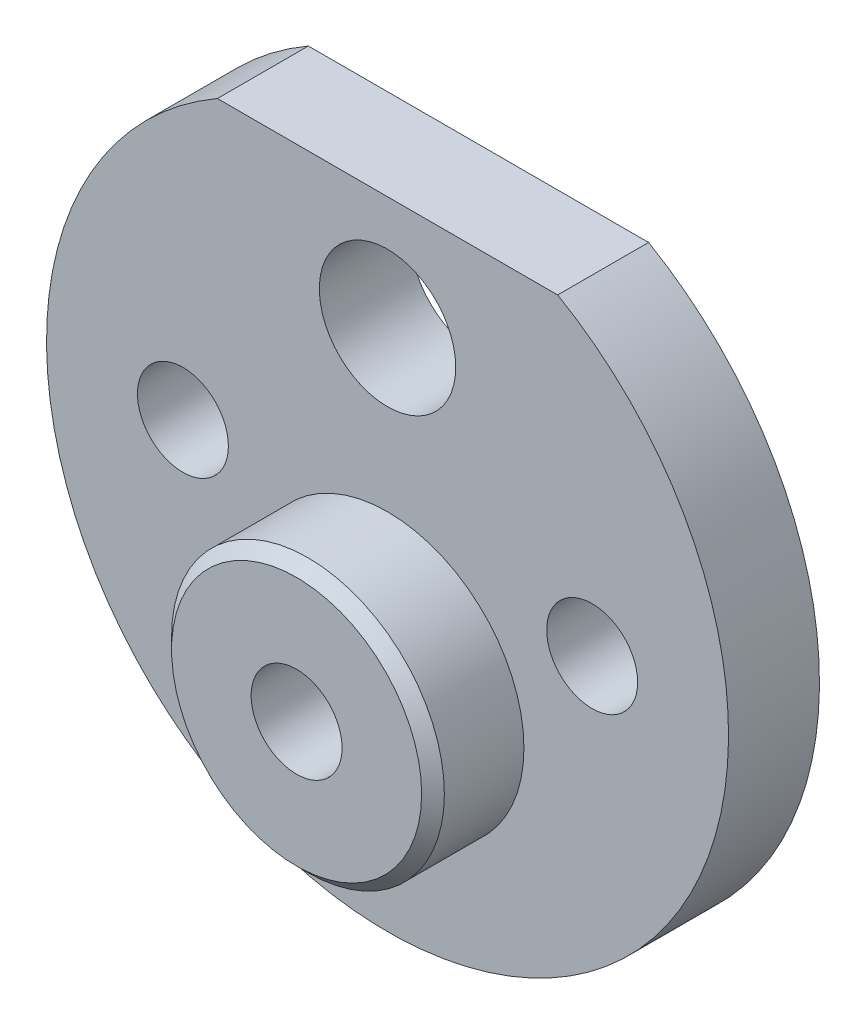
ISO-10303-21;
HEADER;
FILE_DESCRIPTION(('STEP AP214'),'2;1');
FILE_NAME('part.step','',(''),(''),'','','');
FILE_SCHEMA(('AUTOMOTIVE_DESIGN { 1 0 10303 214 1 1 1 1 }'));
ENDSEC;
DATA;
#1=APPLICATION_CONTEXT('core data for automotive mechanical design processes');
#2=APPLICATION_PROTOCOL_DEFINITION('international standard','automotive_design',2000,#1);
#3=PRODUCT_CONTEXT('',#1,'mechanical');
#4=PRODUCT('Part','Part','',(#3));
#5=PRODUCT_RELATED_PRODUCT_CATEGORY('part','',(#4));
#6=PRODUCT_DEFINITION_FORMATION('','',#4);
#7=PRODUCT_DEFINITION_CONTEXT('part definition',#1,'design');
#8=PRODUCT_DEFINITION('design','',#6,#7);
#9=PRODUCT_DEFINITION_SHAPE('','',#8);
#10=(LENGTH_UNIT() NAMED_UNIT(*) SI_UNIT(.MILLI.,.METRE.));
#11=(NAMED_UNIT(*) PLANE_ANGLE_UNIT() SI_UNIT($,.RADIAN.));
#12=(NAMED_UNIT(*) SI_UNIT($,.STERADIAN.) SOLID_ANGLE_UNIT());
#13=UNCERTAINTY_MEASURE_WITH_UNIT(LENGTH_MEASURE(1.E-05),#10,'distance_accuracy_value','');
#14=(GEOMETRIC_REPRESENTATION_CONTEXT(3) GLOBAL_UNCERTAINTY_ASSIGNED_CONTEXT((#13)) GLOBAL_UNIT_ASSIGNED_CONTEXT((#10,
#11,#12)) REPRESENTATION_CONTEXT('',''));
#15=CARTESIAN_POINT('',(0.,0.,0.));
#16=DIRECTION('',(0.,0.,1.));
#17=DIRECTION('',(1.,0.,0.));
#18=AXIS2_PLACEMENT_3D('',#15,#16,#17);
#19=CARTESIAN_POINT('',(0.,0.,4.));
#20=DIRECTION('',(0.,0.,1.));
#21=DIRECTION('',(1.,0.,0.));
#22=AXIS2_PLACEMENT_3D('',#19,#20,#21);
#23=PLANE('',#22);
#24=CARTESIAN_POINT('',(0.,-5.,4.));
#25=DIRECTION('',(0.,0.,1.));
#26=DIRECTION('',(1.,0.,0.));
#27=AXIS2_PLACEMENT_3D('',#24,#25,#26);
#28=CIRCLE('',#27,6.);
#29=CARTESIAN_POINT('',(6.,-5.,4.));
#30=VERTEX_POINT('',#29);
#31=EDGE_CURVE('E192',#30,#30,#28,.T.);
#32=ORIENTED_EDGE('',*,*,#31,.F.);
#33=EDGE_LOOP('',(#32));
#34=FACE_BOUND('',#33,.T.);
#35=CARTESIAN_POINT('',(0.,8.,4.));
#36=DIRECTION('',(0.,0.,1.));
#37=DIRECTION('',(1.,0.,0.));
#38=AXIS2_PLACEMENT_3D('',#35,#36,#37);
#39=CIRCLE('',#38,3.);
#40=CARTESIAN_POINT('',(3.,8.,4.));
#41=VERTEX_POINT('',#40);
#42=EDGE_CURVE('E207',#41,#41,#39,.T.);
#43=ORIENTED_EDGE('',*,*,#42,.F.);
#44=EDGE_LOOP('',(#43));
#45=FACE_BOUND('',#44,.T.);
#46=CARTESIAN_POINT('',(0.,0.,4.));
#47=DIRECTION('',(0.,0.,1.));
#48=DIRECTION('',(1.,0.,0.));
#49=AXIS2_PLACEMENT_3D('',#46,#47,#48);
#50=CIRCLE('',#49,15.);
#51=CARTESIAN_POINT('',(-7.48331477354788,13.,4.));
#52=VERTEX_POINT('',#51);
#53=CARTESIAN_POINT('',(7.48331477354788,13.,4.));
#54=VERTEX_POINT('',#53);
#55=EDGE_CURVE('E66',#52,#54,#50,.T.);
#56=ORIENTED_EDGE('',*,*,#55,.T.);
#57=DIRECTION('',(-1.,0.,0.));
#58=VECTOR('',#57,1.);
#59=CARTESIAN_POINT('',(-7.48331477354788,13.,4.));
#60=LINE('',#59,#58);
#61=EDGE_CURVE('E48',#54,#52,#60,.T.);
#62=ORIENTED_EDGE('',*,*,#61,.T.);
#63=EDGE_LOOP('',(#56,#62));
#64=FACE_BOUND('',#63,.T.);
#65=CARTESIAN_POINT('',(-9.,0.,4.));
#66=DIRECTION('',(0.,0.,1.));
#67=DIRECTION('',(1.,0.,0.));
#68=AXIS2_PLACEMENT_3D('',#65,#66,#67);
#69=CIRCLE('',#68,2.);
#70=CARTESIAN_POINT('',(-7.,0.,4.));
#71=VERTEX_POINT('',#70);
#72=EDGE_CURVE('E74',#71,#71,#69,.T.);
#73=ORIENTED_EDGE('',*,*,#72,.F.);
#74=EDGE_LOOP('',(#73));
#75=FACE_BOUND('',#74,.T.);
#76=CARTESIAN_POINT('',(9.,0.,4.));
#77=DIRECTION('',(0.,0.,1.));
#78=DIRECTION('',(1.,0.,0.));
#79=AXIS2_PLACEMENT_3D('',#76,#77,#78);
#80=CIRCLE('',#79,2.);
#81=CARTESIAN_POINT('',(11.,0.,4.));
#82=VERTEX_POINT('',#81);
#83=EDGE_CURVE('E197',#82,#82,#80,.T.);
#84=ORIENTED_EDGE('',*,*,#83,.F.);
#85=EDGE_LOOP('',(#84));
#86=FACE_BOUND('',#85,.T.);
#87=ADVANCED_FACE('F32',(#34,#45,#64,#75,#86),#23,.T.);
#88=CARTESIAN_POINT('',(0.,0.,0.));
#89=DIRECTION('',(0.,0.,1.));
#90=DIRECTION('',(1.,0.,0.));
#91=AXIS2_PLACEMENT_3D('',#88,#89,#90);
#92=PLANE('',#91);
#93=CARTESIAN_POINT('',(0.,-5.,0.));
#94=DIRECTION('',(0.,0.,1.));
#95=DIRECTION('',(1.,0.,0.));
#96=AXIS2_PLACEMENT_3D('',#93,#94,#95);
#97=CIRCLE('',#96,2.);
#98=CARTESIAN_POINT('',(2.,-5.,0.));
#99=VERTEX_POINT('',#98);
#100=EDGE_CURVE('E194',#99,#99,#97,.T.);
#101=ORIENTED_EDGE('',*,*,#100,.T.);
#102=EDGE_LOOP('',(#101));
#103=FACE_BOUND('',#102,.T.);
#104=CARTESIAN_POINT('',(0.,0.,0.));
#105=DIRECTION('',(0.,0.,1.));
#106=DIRECTION('',(1.,0.,0.));
#107=AXIS2_PLACEMENT_3D('',#104,#105,#106);
#108=CIRCLE('',#107,15.);
#109=CARTESIAN_POINT('',(-7.48331477354788,13.,0.));
#110=VERTEX_POINT('',#109);
#111=CARTESIAN_POINT('',(7.48331477354788,13.,0.));
#112=VERTEX_POINT('',#111);
#113=EDGE_CURVE('E67',#110,#112,#108,.T.);
#114=ORIENTED_EDGE('',*,*,#113,.F.);
#115=DIRECTION('',(-1.,0.,0.));
#116=VECTOR('',#115,1.);
#117=CARTESIAN_POINT('',(-7.48331477354788,13.,0.));
#118=LINE('',#117,#116);
#119=EDGE_CURVE('E56',#112,#110,#118,.T.);
#120=ORIENTED_EDGE('',*,*,#119,.F.);
#121=EDGE_LOOP('',(#114,#120));
#122=FACE_BOUND('',#121,.T.);
#123=CARTESIAN_POINT('',(-9.,0.,0.));
#124=DIRECTION('',(0.,0.,1.));
#125=DIRECTION('',(1.,0.,0.));
#126=AXIS2_PLACEMENT_3D('',#123,#124,#125);
#127=CIRCLE('',#126,2.);
#128=CARTESIAN_POINT('',(-7.,0.,0.));
#129=VERTEX_POINT('',#128);
#130=EDGE_CURVE('E77',#129,#129,#127,.T.);
#131=ORIENTED_EDGE('',*,*,#130,.T.);
#132=EDGE_LOOP('',(#131));
#133=FACE_BOUND('',#132,.T.);
#134=CARTESIAN_POINT('',(0.,8.,0.));
#135=DIRECTION('',(0.,0.,1.));
#136=DIRECTION('',(1.,0.,0.));
#137=AXIS2_PLACEMENT_3D('',#134,#135,#136);
#138=CIRCLE('',#137,3.);
#139=CARTESIAN_POINT('',(3.,8.,0.));
#140=VERTEX_POINT('',#139);
#141=EDGE_CURVE('E205',#140,#140,#138,.T.);
#142=ORIENTED_EDGE('',*,*,#141,.T.);
#143=EDGE_LOOP('',(#142));
#144=FACE_BOUND('',#143,.T.);
#145=CARTESIAN_POINT('',(9.,0.,0.));
#146=DIRECTION('',(0.,0.,1.));
#147=DIRECTION('',(1.,0.,0.));
#148=AXIS2_PLACEMENT_3D('',#145,#146,#147);
#149=CIRCLE('',#148,2.);
#150=CARTESIAN_POINT('',(11.,0.,0.));
#151=VERTEX_POINT('',#150);
#152=EDGE_CURVE('E193',#151,#151,#149,.T.);
#153=ORIENTED_EDGE('',*,*,#152,.T.);
#154=EDGE_LOOP('',(#153));
#155=FACE_BOUND('',#154,.T.);
#156=ADVANCED_FACE('F72',(#103,#122,#133,#144,#155),#92,.F.);
#157=CARTESIAN_POINT('',(0.,0.,4.));
#158=DIRECTION('',(0.,0.,-1.));
#159=DIRECTION('',(-1.,0.,0.));
#160=AXIS2_PLACEMENT_3D('',#157,#158,#159);
#161=CYLINDRICAL_SURFACE('',#160,15.);
#162=ORIENTED_EDGE('',*,*,#113,.T.);
#163=DIRECTION('',(0.,0.,-1.));
#164=VECTOR('',#163,1.);
#165=CARTESIAN_POINT('',(7.48331477354788,13.,4.));
#166=LINE('',#165,#164);
#167=EDGE_CURVE('E64',#54,#112,#166,.T.);
#168=ORIENTED_EDGE('',*,*,#167,.F.);
#169=ORIENTED_EDGE('',*,*,#55,.F.);
#170=DIRECTION('',(0.,0.,-1.));
#171=VECTOR('',#170,1.);
#172=CARTESIAN_POINT('',(-7.48331477354788,13.,4.));
#173=LINE('',#172,#171);
#174=EDGE_CURVE('E61',#52,#110,#173,.T.);
#175=ORIENTED_EDGE('',*,*,#174,.T.);
#176=EDGE_LOOP('',(#162,#168,#169,#175));
#177=FACE_BOUND('',#176,.T.);
#178=ADVANCED_FACE('F70',(#177),#161,.T.);
#179=CARTESIAN_POINT('',(-7.48331477354788,13.,4.));
#180=DIRECTION('',(0.,-1.,0.));
#181=DIRECTION('',(0.,0.,-1.));
#182=AXIS2_PLACEMENT_3D('',#179,#180,#181);
#183=PLANE('',#182);
#184=ORIENTED_EDGE('',*,*,#119,.T.);
#185=ORIENTED_EDGE('',*,*,#174,.F.);
#186=ORIENTED_EDGE('',*,*,#61,.F.);
#187=ORIENTED_EDGE('',*,*,#167,.T.);
#188=EDGE_LOOP('',(#184,#185,#186,#187));
#189=FACE_BOUND('',#188,.T.);
#190=ADVANCED_FACE('F60',(#189),#183,.F.);
#191=CARTESIAN_POINT('',(-9.,0.,4.));
#192=DIRECTION('',(0.,0.,-1.));
#193=DIRECTION('',(-1.,0.,0.));
#194=AXIS2_PLACEMENT_3D('',#191,#192,#193);
#195=CYLINDRICAL_SURFACE('',#194,2.);
#196=ORIENTED_EDGE('',*,*,#72,.T.);
#197=EDGE_LOOP('',(#196));
#198=FACE_BOUND('',#197,.T.);
#199=ORIENTED_EDGE('',*,*,#130,.F.);
#200=EDGE_LOOP('',(#199));
#201=FACE_BOUND('',#200,.T.);
#202=ADVANCED_FACE('F108',(#198,#201),#195,.F.);
#203=CARTESIAN_POINT('',(0.,8.,4.));
#204=DIRECTION('',(0.,0.,-1.));
#205=DIRECTION('',(-1.,0.,0.));
#206=AXIS2_PLACEMENT_3D('',#203,#204,#205);
#207=CYLINDRICAL_SURFACE('',#206,3.);
#208=ORIENTED_EDGE('',*,*,#42,.T.);
#209=EDGE_LOOP('',(#208));
#210=FACE_BOUND('',#209,.T.);
#211=ORIENTED_EDGE('',*,*,#141,.F.);
#212=EDGE_LOOP('',(#211));
#213=FACE_BOUND('',#212,.T.);
#214=ADVANCED_FACE('F127',(#210,#213),#207,.F.);
#215=CARTESIAN_POINT('',(9.,0.,4.));
#216=DIRECTION('',(0.,0.,-1.));
#217=DIRECTION('',(-1.,0.,0.));
#218=AXIS2_PLACEMENT_3D('',#215,#216,#217);
#219=CYLINDRICAL_SURFACE('',#218,2.);
#220=ORIENTED_EDGE('',*,*,#83,.T.);
#221=EDGE_LOOP('',(#220));
#222=FACE_BOUND('',#221,.T.);
#223=ORIENTED_EDGE('',*,*,#152,.F.);
#224=EDGE_LOOP('',(#223));
#225=FACE_BOUND('',#224,.T.);
#226=ADVANCED_FACE('F134',(#222,#225),#219,.F.);
#227=CARTESIAN_POINT('',(0.,-5.,8.));
#228=DIRECTION('',(0.,0.,-1.));
#229=DIRECTION('',(-1.,0.,0.));
#230=AXIS2_PLACEMENT_3D('',#227,#228,#229);
#231=CYLINDRICAL_SURFACE('',#230,6.);
#232=CARTESIAN_POINT('',(0.,-5.,7.50000000000001));
#233=DIRECTION('',(0.,0.,1.));
#234=DIRECTION('',(1.,0.,0.));
#235=AXIS2_PLACEMENT_3D('',#232,#233,#234);
#236=CIRCLE('',#235,6.);
#237=CARTESIAN_POINT('',(6.,-5.,7.50000000000001));
#238=VERTEX_POINT('',#237);
#239=EDGE_CURVE('E11',#238,#238,#236,.F.);
#240=ORIENTED_EDGE('',*,*,#239,.T.);
#241=EDGE_LOOP('',(#240));
#242=FACE_BOUND('',#241,.T.);
#243=ORIENTED_EDGE('',*,*,#31,.T.);
#244=EDGE_LOOP('',(#243));
#245=FACE_BOUND('',#244,.T.);
#246=ADVANCED_FACE('F141',(#242,#245),#231,.T.);
#247=CARTESIAN_POINT('',(0.,-5.,8.));
#248=DIRECTION('',(0.,0.,1.));
#249=DIRECTION('',(1.,0.,0.));
#250=AXIS2_PLACEMENT_3D('',#247,#248,#249);
#251=PLANE('',#250);
#252=CARTESIAN_POINT('',(0.,-5.,8.));
#253=DIRECTION('',(0.,0.,1.));
#254=DIRECTION('',(1.,0.,0.));
#255=AXIS2_PLACEMENT_3D('',#252,#253,#254);
#256=CIRCLE('',#255,5.50000000000001);
#257=CARTESIAN_POINT('',(5.50000000000001,-5.,8.));
#258=VERTEX_POINT('',#257);
#259=EDGE_CURVE('E41',#258,#258,#256,.T.);
#260=ORIENTED_EDGE('',*,*,#259,.T.);
#261=EDGE_LOOP('',(#260));
#262=FACE_BOUND('',#261,.T.);
#263=CARTESIAN_POINT('',(0.,-5.,8.));
#264=DIRECTION('',(0.,0.,1.));
#265=DIRECTION('',(1.,0.,0.));
#266=AXIS2_PLACEMENT_3D('',#263,#264,#265);
#267=CIRCLE('',#266,2.);
#268=CARTESIAN_POINT('',(2.,-5.,8.));
#269=VERTEX_POINT('',#268);
#270=EDGE_CURVE('E200',#269,#269,#267,.T.);
#271=ORIENTED_EDGE('',*,*,#270,.F.);
#272=EDGE_LOOP('',(#271));
#273=FACE_BOUND('',#272,.T.);
#274=ADVANCED_FACE('F85',(#262,#273),#251,.T.);
#275=CARTESIAN_POINT('',(0.,-5.,0.));
#276=DIRECTION('',(0.,0.,1.));
#277=DIRECTION('',(1.,0.,0.));
#278=AXIS2_PLACEMENT_3D('',#275,#276,#277);
#279=CYLINDRICAL_SURFACE('',#278,2.);
#280=ORIENTED_EDGE('',*,*,#100,.F.);
#281=EDGE_LOOP('',(#280));
#282=FACE_BOUND('',#281,.T.);
#283=ORIENTED_EDGE('',*,*,#270,.T.);
#284=EDGE_LOOP('',(#283));
#285=FACE_BOUND('',#284,.T.);
#286=ADVANCED_FACE('F89',(#282,#285),#279,.F.);
#287=CARTESIAN_POINT('',(0.,-5.,8.));
#288=DIRECTION('',(0.,0.,-1.));
#289=DIRECTION('',(-1.,0.,0.));
#290=AXIS2_PLACEMENT_3D('',#287,#288,#289);
#291=CONICAL_SURFACE('',#290,5.50000000000001,0.785398163397451);
#292=ORIENTED_EDGE('',*,*,#239,.F.);
#293=EDGE_LOOP('',(#292));
#294=FACE_BOUND('',#293,.T.);
#295=ORIENTED_EDGE('',*,*,#259,.F.);
#296=EDGE_LOOP('',(#295));
#297=FACE_BOUND('',#296,.T.);
#298=ADVANCED_FACE('F34',(#294,#297),#291,.T.);
#299=CLOSED_SHELL('',(#87,#156,#178,#190,#202,#214,#226,#246,#274,#286,#298));
#300=MANIFOLD_SOLID_BREP('B2',#299);
#301=ADVANCED_BREP_SHAPE_REPRESENTATION('',(#18,#300),#14);
#302=SHAPE_DEFINITION_REPRESENTATION(#9,#301);
ENDSEC;
END-ISO-10303-21;
